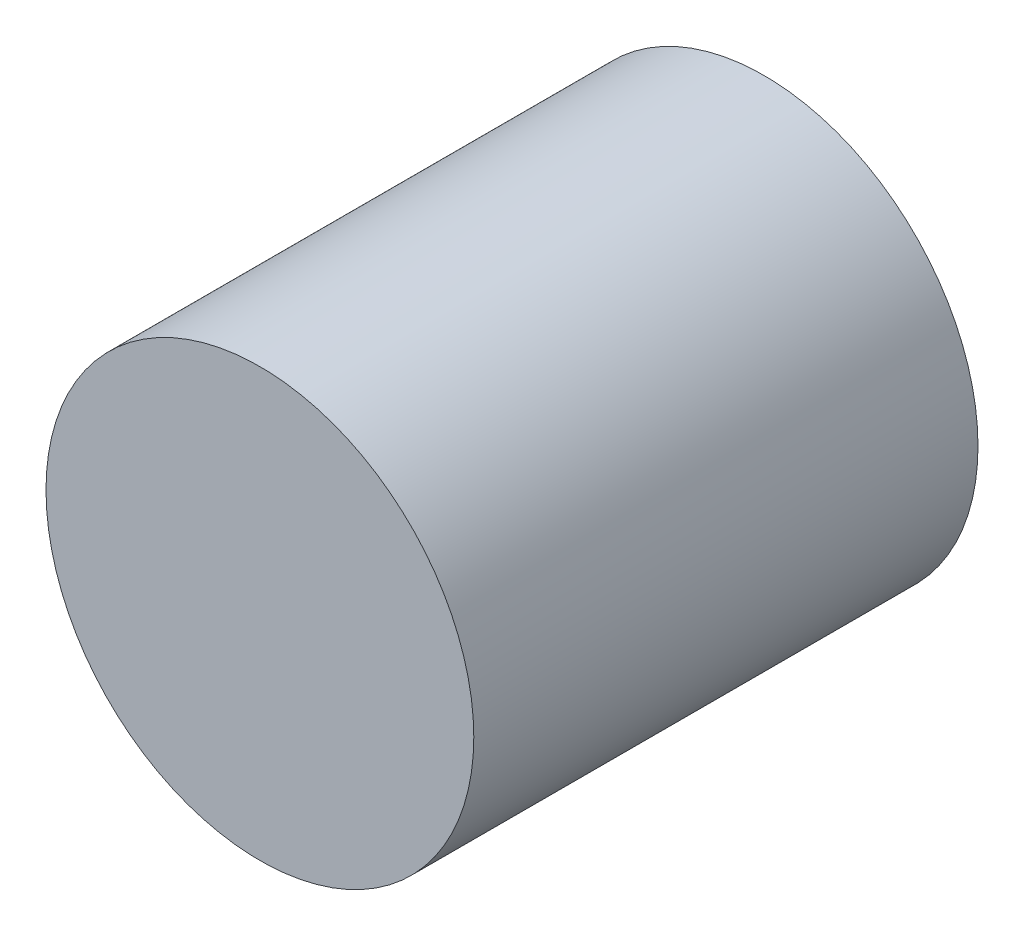
ISO-10303-21;
HEADER;
FILE_DESCRIPTION(('STEP AP214'),'2;1');
FILE_NAME('part.step','',(''),(''),'','','');
FILE_SCHEMA(('AUTOMOTIVE_DESIGN { 1 0 10303 214 1 1 1 1 }'));
ENDSEC;
DATA;
#1=APPLICATION_CONTEXT('core data for automotive mechanical design processes');
#2=APPLICATION_PROTOCOL_DEFINITION('international standard','automotive_design',2000,#1);
#3=PRODUCT_CONTEXT('',#1,'mechanical');
#4=PRODUCT('Part','Part','',(#3));
#5=PRODUCT_RELATED_PRODUCT_CATEGORY('part','',(#4));
#6=PRODUCT_DEFINITION_FORMATION('','',#4);
#7=PRODUCT_DEFINITION_CONTEXT('part definition',#1,'design');
#8=PRODUCT_DEFINITION('design','',#6,#7);
#9=PRODUCT_DEFINITION_SHAPE('','',#8);
#10=(LENGTH_UNIT() NAMED_UNIT(*) SI_UNIT(.MILLI.,.METRE.));
#11=(NAMED_UNIT(*) PLANE_ANGLE_UNIT() SI_UNIT($,.RADIAN.));
#12=(NAMED_UNIT(*) SI_UNIT($,.STERADIAN.) SOLID_ANGLE_UNIT());
#13=UNCERTAINTY_MEASURE_WITH_UNIT(LENGTH_MEASURE(1.E-05),#10,'distance_accuracy_value','');
#14=(GEOMETRIC_REPRESENTATION_CONTEXT(3) GLOBAL_UNCERTAINTY_ASSIGNED_CONTEXT((#13)) GLOBAL_UNIT_ASSIGNED_CONTEXT((#10,
#11,#12)) REPRESENTATION_CONTEXT('',''));
#15=CARTESIAN_POINT('',(0.,0.,0.));
#16=DIRECTION('',(0.,0.,1.));
#17=DIRECTION('',(1.,0.,0.));
#18=AXIS2_PLACEMENT_3D('',#15,#16,#17);
#19=CARTESIAN_POINT('',(0.,0.,33.));
#20=DIRECTION('',(0.,0.,-1.));
#21=DIRECTION('',(-1.,0.,0.));
#22=AXIS2_PLACEMENT_3D('',#19,#20,#21);
#23=CYLINDRICAL_SURFACE('',#22,14.);
#24=CARTESIAN_POINT('',(0.,0.,33.));
#25=DIRECTION('',(0.,0.,1.));
#26=DIRECTION('',(1.,0.,0.));
#27=AXIS2_PLACEMENT_3D('',#24,#25,#26);
#28=CIRCLE('',#27,14.);
#29=CARTESIAN_POINT('',(14.,0.,33.));
#30=VERTEX_POINT('',#29);
#31=EDGE_CURVE('E10',#30,#30,#28,.T.);
#32=ORIENTED_EDGE('',*,*,#31,.F.);
#33=EDGE_LOOP('',(#32));
#34=FACE_BOUND('',#33,.T.);
#35=CARTESIAN_POINT('',(0.,0.,0.));
#36=DIRECTION('',(0.,0.,1.));
#37=DIRECTION('',(1.,0.,0.));
#38=AXIS2_PLACEMENT_3D('',#35,#36,#37);
#39=CIRCLE('',#38,14.);
#40=CARTESIAN_POINT('',(14.,0.,0.));
#41=VERTEX_POINT('',#40);
#42=EDGE_CURVE('E44',#41,#41,#39,.T.);
#43=ORIENTED_EDGE('',*,*,#42,.T.);
#44=EDGE_LOOP('',(#43));
#45=FACE_BOUND('',#44,.T.);
#46=ADVANCED_FACE('F41',(#34,#45),#23,.T.);
#47=CARTESIAN_POINT('',(0.,0.,33.));
#48=DIRECTION('',(0.,0.,1.));
#49=DIRECTION('',(1.,0.,0.));
#50=AXIS2_PLACEMENT_3D('',#47,#48,#49);
#51=PLANE('',#50);
#52=ORIENTED_EDGE('',*,*,#31,.T.);
#53=EDGE_LOOP('',(#52));
#54=FACE_BOUND('',#53,.T.);
#55=ADVANCED_FACE('F56',(#54),#51,.T.);
#56=CARTESIAN_POINT('',(0.,0.,0.));
#57=DIRECTION('',(0.,0.,1.));
#58=DIRECTION('',(1.,0.,0.));
#59=AXIS2_PLACEMENT_3D('',#56,#57,#58);
#60=PLANE('',#59);
#61=ORIENTED_EDGE('',*,*,#42,.F.);
#62=EDGE_LOOP('',(#61));
#63=FACE_BOUND('',#62,.T.);
#64=ADVANCED_FACE('F54',(#63),#60,.F.);
#65=CLOSED_SHELL('',(#46,#55,#64));
#66=MANIFOLD_SOLID_BREP('B2',#65);
#67=ADVANCED_BREP_SHAPE_REPRESENTATION('',(#18,#66),#14);
#68=SHAPE_DEFINITION_REPRESENTATION(#9,#67);
ENDSEC;
END-ISO-10303-21;
